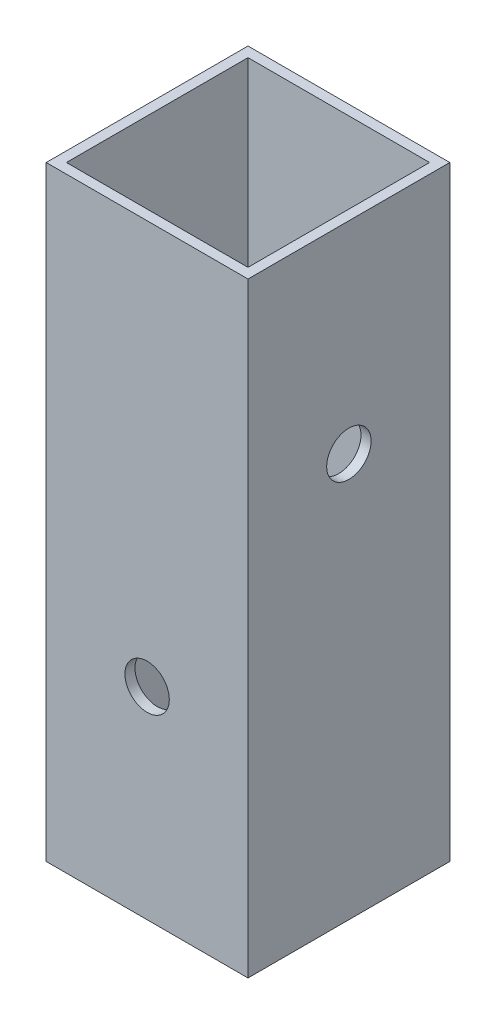
ISO-10303-21;
HEADER;
FILE_DESCRIPTION(('STEP AP214'),'2;1');
FILE_NAME('part.step','',(''),(''),'','','');
FILE_SCHEMA(('AUTOMOTIVE_DESIGN { 1 0 10303 214 1 1 1 1 }'));
ENDSEC;
DATA;
#1=APPLICATION_CONTEXT('core data for automotive mechanical design processes');
#2=APPLICATION_PROTOCOL_DEFINITION('international standard','automotive_design',2000,#1);
#3=PRODUCT_CONTEXT('',#1,'mechanical');
#4=PRODUCT('Part','Part','',(#3));
#5=PRODUCT_RELATED_PRODUCT_CATEGORY('part','',(#4));
#6=PRODUCT_DEFINITION_FORMATION('','',#4);
#7=PRODUCT_DEFINITION_CONTEXT('part definition',#1,'design');
#8=PRODUCT_DEFINITION('design','',#6,#7);
#9=PRODUCT_DEFINITION_SHAPE('','',#8);
#10=(LENGTH_UNIT() NAMED_UNIT(*) SI_UNIT(.MILLI.,.METRE.));
#11=(NAMED_UNIT(*) PLANE_ANGLE_UNIT() SI_UNIT($,.RADIAN.));
#12=(NAMED_UNIT(*) SI_UNIT($,.STERADIAN.) SOLID_ANGLE_UNIT());
#13=UNCERTAINTY_MEASURE_WITH_UNIT(LENGTH_MEASURE(1.E-05),#10,'distance_accuracy_value','');
#14=(GEOMETRIC_REPRESENTATION_CONTEXT(3) GLOBAL_UNCERTAINTY_ASSIGNED_CONTEXT((#13)) GLOBAL_UNIT_ASSIGNED_CONTEXT((#10,
#11,#12)) REPRESENTATION_CONTEXT('',''));
#15=CARTESIAN_POINT('',(0.,0.,0.));
#16=DIRECTION('',(0.,0.,1.));
#17=DIRECTION('',(1.,0.,0.));
#18=AXIS2_PLACEMENT_3D('',#15,#16,#17);
#19=CARTESIAN_POINT('',(0.,-280.,10.));
#20=DIRECTION('',(0.,0.,1.));
#21=DIRECTION('',(1.,0.,0.));
#22=AXIS2_PLACEMENT_3D('',#19,#20,#21);
#23=PLANE('',#22);
#24=DIRECTION('',(1.,0.,0.));
#25=VECTOR('',#24,1.);
#26=CARTESIAN_POINT('',(1.85733876412832E-12,-220.,10.));
#27=LINE('',#26,#25);
#28=CARTESIAN_POINT('',(-10.0000000000001,-220.,10.));
#29=VERTEX_POINT('',#28);
#30=CARTESIAN_POINT('',(9.99999999999997,-220.,10.));
#31=VERTEX_POINT('',#30);
#32=EDGE_CURVE('E108',#29,#31,#27,.T.);
#33=ORIENTED_EDGE('',*,*,#32,.F.);
#34=DIRECTION('',(0.,1.,0.));
#35=VECTOR('',#34,1.);
#36=CARTESIAN_POINT('',(-10.0000000000001,-280.,9.99999999999993));
#37=LINE('',#36,#35);
#38=CARTESIAN_POINT('',(-10.0000000000001,-280.,9.99999999999993));
#39=VERTEX_POINT('',#38);
#40=EDGE_CURVE('E49',#39,#29,#37,.T.);
#41=ORIENTED_EDGE('',*,*,#40,.F.);
#42=DIRECTION('',(1.,0.,0.));
#43=VECTOR('',#42,1.);
#44=CARTESIAN_POINT('',(0.,-280.,10.));
#45=LINE('',#44,#43);
#46=CARTESIAN_POINT('',(9.99999999999997,-280.,10.));
#47=VERTEX_POINT('',#46);
#48=EDGE_CURVE('E64',#39,#47,#45,.T.);
#49=ORIENTED_EDGE('',*,*,#48,.T.);
#50=DIRECTION('',(0.,1.,0.));
#51=VECTOR('',#50,1.);
#52=CARTESIAN_POINT('',(9.99999999999997,-280.,10.));
#53=LINE('',#52,#51);
#54=EDGE_CURVE('E11',#47,#31,#53,.T.);
#55=ORIENTED_EDGE('',*,*,#54,.T.);
#56=EDGE_LOOP('',(#33,#41,#49,#55));
#57=FACE_BOUND('',#56,.T.);
#58=CARTESIAN_POINT('',(2.2763165247895E-12,-260.,10.));
#59=DIRECTION('',(0.,0.,1.));
#60=DIRECTION('',(1.,0.,0.));
#61=AXIS2_PLACEMENT_3D('',#58,#59,#60);
#62=CIRCLE('',#61,2.19999999999999);
#63=CARTESIAN_POINT('',(2.20000000000227,-260.,10.));
#64=VERTEX_POINT('',#63);
#65=EDGE_CURVE('E133',#64,#64,#62,.T.);
#66=ORIENTED_EDGE('',*,*,#65,.F.);
#67=EDGE_LOOP('',(#66));
#68=FACE_BOUND('',#67,.T.);
#69=ADVANCED_FACE('F39',(#57,#68),#23,.T.);
#70=CARTESIAN_POINT('',(-10.,-280.,0.));
#71=DIRECTION('',(-1.,0.,0.));
#72=DIRECTION('',(0.,0.,1.));
#73=AXIS2_PLACEMENT_3D('',#70,#71,#72);
#74=PLANE('',#73);
#75=DIRECTION('',(0.,0.,1.));
#76=VECTOR('',#75,1.);
#77=CARTESIAN_POINT('',(-10.0000000000001,-220.,-49.));
#78=LINE('',#77,#76);
#79=CARTESIAN_POINT('',(-10.0000000000001,-220.,-10.));
#80=VERTEX_POINT('',#79);
#81=EDGE_CURVE('E115',#80,#29,#78,.T.);
#82=ORIENTED_EDGE('',*,*,#81,.F.);
#83=DIRECTION('',(0.,1.,0.));
#84=VECTOR('',#83,1.);
#85=CARTESIAN_POINT('',(-9.9999999999999,-280.,-10.0000000000001));
#86=LINE('',#85,#84);
#87=CARTESIAN_POINT('',(-9.9999999999999,-280.,-10.0000000000001));
#88=VERTEX_POINT('',#87);
#89=EDGE_CURVE('E196',#88,#80,#86,.T.);
#90=ORIENTED_EDGE('',*,*,#89,.F.);
#91=DIRECTION('',(0.,0.,1.));
#92=VECTOR('',#91,1.);
#93=CARTESIAN_POINT('',(-10.,-280.,0.));
#94=LINE('',#93,#92);
#95=EDGE_CURVE('E189',#88,#39,#94,.T.);
#96=ORIENTED_EDGE('',*,*,#95,.T.);
#97=ORIENTED_EDGE('',*,*,#40,.T.);
#98=EDGE_LOOP('',(#82,#90,#96,#97));
#99=FACE_BOUND('',#98,.T.);
#100=CARTESIAN_POINT('',(-10.,-240.,0.));
#101=DIRECTION('',(1.,0.,0.));
#102=DIRECTION('',(0.,0.,-1.));
#103=AXIS2_PLACEMENT_3D('',#100,#101,#102);
#104=CIRCLE('',#103,2.2);
#105=CARTESIAN_POINT('',(-10.,-240.,-2.20000000000001));
#106=VERTEX_POINT('',#105);
#107=EDGE_CURVE('E336',#106,#106,#104,.T.);
#108=ORIENTED_EDGE('',*,*,#107,.T.);
#109=EDGE_LOOP('',(#108));
#110=FACE_BOUND('',#109,.T.);
#111=ADVANCED_FACE('F129',(#99,#110),#74,.T.);
#112=CARTESIAN_POINT('',(0.,-280.,-10.));
#113=DIRECTION('',(0.,0.,-1.));
#114=DIRECTION('',(-1.,0.,0.));
#115=AXIS2_PLACEMENT_3D('',#112,#113,#114);
#116=PLANE('',#115);
#117=DIRECTION('',(-1.,0.,0.));
#118=VECTOR('',#117,1.);
#119=CARTESIAN_POINT('',(0.,-220.,-10.));
#120=LINE('',#119,#118);
#121=CARTESIAN_POINT('',(9.99999999999997,-220.,-10.));
#122=VERTEX_POINT('',#121);
#123=EDGE_CURVE('E205',#122,#80,#120,.T.);
#124=ORIENTED_EDGE('',*,*,#123,.F.);
#125=DIRECTION('',(0.,1.,0.));
#126=VECTOR('',#125,1.);
#127=CARTESIAN_POINT('',(10.,-280.,-10.));
#128=LINE('',#127,#126);
#129=CARTESIAN_POINT('',(10.,-280.,-10.));
#130=VERTEX_POINT('',#129);
#131=EDGE_CURVE('E124',#130,#122,#128,.T.);
#132=ORIENTED_EDGE('',*,*,#131,.F.);
#133=DIRECTION('',(-1.,0.,0.));
#134=VECTOR('',#133,1.);
#135=CARTESIAN_POINT('',(0.,-280.,-10.));
#136=LINE('',#135,#134);
#137=EDGE_CURVE('E186',#130,#88,#136,.T.);
#138=ORIENTED_EDGE('',*,*,#137,.T.);
#139=ORIENTED_EDGE('',*,*,#89,.T.);
#140=EDGE_LOOP('',(#124,#132,#138,#139));
#141=FACE_BOUND('',#140,.T.);
#142=CARTESIAN_POINT('',(2.2763165247895E-12,-260.,-10.));
#143=DIRECTION('',(0.,0.,-1.));
#144=DIRECTION('',(-1.,0.,0.));
#145=AXIS2_PLACEMENT_3D('',#142,#143,#144);
#146=CIRCLE('',#145,2.19999999999999);
#147=CARTESIAN_POINT('',(-2.19999999999772,-260.,-10.));
#148=VERTEX_POINT('',#147);
#149=EDGE_CURVE('E150',#148,#148,#146,.T.);
#150=ORIENTED_EDGE('',*,*,#149,.F.);
#151=EDGE_LOOP('',(#150));
#152=FACE_BOUND('',#151,.T.);
#153=ADVANCED_FACE('F203',(#141,#152),#116,.T.);
#154=CARTESIAN_POINT('',(10.,-280.,0.));
#155=DIRECTION('',(1.,0.,0.));
#156=DIRECTION('',(0.,0.,-1.));
#157=AXIS2_PLACEMENT_3D('',#154,#155,#156);
#158=PLANE('',#157);
#159=DIRECTION('',(0.,0.,1.));
#160=VECTOR('',#159,1.);
#161=CARTESIAN_POINT('',(9.99999999999997,-220.,-49.));
#162=LINE('',#161,#160);
#163=EDGE_CURVE('E112',#122,#31,#162,.T.);
#164=ORIENTED_EDGE('',*,*,#163,.T.);
#165=ORIENTED_EDGE('',*,*,#54,.F.);
#166=DIRECTION('',(0.,0.,-1.));
#167=VECTOR('',#166,1.);
#168=CARTESIAN_POINT('',(10.,-280.,0.));
#169=LINE('',#168,#167);
#170=EDGE_CURVE('E173',#47,#130,#169,.T.);
#171=ORIENTED_EDGE('',*,*,#170,.T.);
#172=ORIENTED_EDGE('',*,*,#131,.T.);
#173=EDGE_LOOP('',(#164,#165,#171,#172));
#174=FACE_BOUND('',#173,.T.);
#175=CARTESIAN_POINT('',(10.,-240.,0.));
#176=DIRECTION('',(1.,0.,0.));
#177=DIRECTION('',(0.,0.,-1.));
#178=AXIS2_PLACEMENT_3D('',#175,#176,#177);
#179=CIRCLE('',#178,2.2);
#180=CARTESIAN_POINT('',(10.,-240.,-2.20000000000001));
#181=VERTEX_POINT('',#180);
#182=EDGE_CURVE('E359',#181,#181,#179,.T.);
#183=ORIENTED_EDGE('',*,*,#182,.F.);
#184=EDGE_LOOP('',(#183));
#185=FACE_BOUND('',#184,.T.);
#186=ADVANCED_FACE('F41',(#174,#185),#158,.T.);
#187=CARTESIAN_POINT('',(0.,-280.,0.));
#188=DIRECTION('',(0.,1.,0.));
#189=DIRECTION('',(0.,0.,1.));
#190=AXIS2_PLACEMENT_3D('',#187,#188,#189);
#191=PLANE('',#190);
#192=DIRECTION('',(0.,0.,1.));
#193=VECTOR('',#192,1.);
#194=CARTESIAN_POINT('',(-9.,-280.,0.));
#195=LINE('',#194,#193);
#196=CARTESIAN_POINT('',(-8.99999999999991,-280.,-9.00000000000009));
#197=VERTEX_POINT('',#196);
#198=CARTESIAN_POINT('',(-9.00000000000006,-280.,8.99999999999994));
#199=VERTEX_POINT('',#198);
#200=EDGE_CURVE('E160',#197,#199,#195,.T.);
#201=ORIENTED_EDGE('',*,*,#200,.T.);
#202=DIRECTION('',(1.,0.,0.));
#203=VECTOR('',#202,1.);
#204=CARTESIAN_POINT('',(0.,-280.,9.));
#205=LINE('',#204,#203);
#206=CARTESIAN_POINT('',(8.99999999999997,-280.,9.00000000000003));
#207=VERTEX_POINT('',#206);
#208=EDGE_CURVE('E164',#199,#207,#205,.T.);
#209=ORIENTED_EDGE('',*,*,#208,.T.);
#210=DIRECTION('',(0.,0.,-1.));
#211=VECTOR('',#210,1.);
#212=CARTESIAN_POINT('',(9.,-280.,0.));
#213=LINE('',#212,#211);
#214=CARTESIAN_POINT('',(9.,-280.,-9.));
#215=VERTEX_POINT('',#214);
#216=EDGE_CURVE('E154',#207,#215,#213,.T.);
#217=ORIENTED_EDGE('',*,*,#216,.T.);
#218=DIRECTION('',(-1.,0.,0.));
#219=VECTOR('',#218,1.);
#220=CARTESIAN_POINT('',(0.,-280.,-9.));
#221=LINE('',#220,#219);
#222=EDGE_CURVE('E57',#215,#197,#221,.T.);
#223=ORIENTED_EDGE('',*,*,#222,.T.);
#224=EDGE_LOOP('',(#201,#209,#217,#223));
#225=FACE_BOUND('',#224,.T.);
#226=ORIENTED_EDGE('',*,*,#170,.F.);
#227=ORIENTED_EDGE('',*,*,#48,.F.);
#228=ORIENTED_EDGE('',*,*,#95,.F.);
#229=ORIENTED_EDGE('',*,*,#137,.F.);
#230=EDGE_LOOP('',(#226,#227,#228,#229));
#231=FACE_BOUND('',#230,.T.);
#232=ADVANCED_FACE('F211',(#225,#231),#191,.F.);
#233=CARTESIAN_POINT('',(0.,-280.,9.));
#234=DIRECTION('',(0.,0.,1.));
#235=DIRECTION('',(1.,0.,0.));
#236=AXIS2_PLACEMENT_3D('',#233,#234,#235);
#237=PLANE('',#236);
#238=DIRECTION('',(0.,1.,0.));
#239=VECTOR('',#238,1.);
#240=CARTESIAN_POINT('',(-9.00000000000006,-280.,8.99999999999994));
#241=LINE('',#240,#239);
#242=CARTESIAN_POINT('',(-9.00000000000006,-220.,8.99999999999997));
#243=VERTEX_POINT('',#242);
#244=EDGE_CURVE('E174',#199,#243,#241,.T.);
#245=ORIENTED_EDGE('',*,*,#244,.T.);
#246=DIRECTION('',(1.,0.,0.));
#247=VECTOR('',#246,1.);
#248=CARTESIAN_POINT('',(0.,-220.,9.));
#249=LINE('',#248,#247);
#250=CARTESIAN_POINT('',(9.,-220.,9.00000000000003));
#251=VERTEX_POINT('',#250);
#252=EDGE_CURVE('E349',#243,#251,#249,.T.);
#253=ORIENTED_EDGE('',*,*,#252,.T.);
#254=DIRECTION('',(0.,1.,0.));
#255=VECTOR('',#254,1.);
#256=CARTESIAN_POINT('',(8.99999999999997,-280.,9.00000000000003));
#257=LINE('',#256,#255);
#258=EDGE_CURVE('E169',#207,#251,#257,.T.);
#259=ORIENTED_EDGE('',*,*,#258,.F.);
#260=ORIENTED_EDGE('',*,*,#208,.F.);
#261=EDGE_LOOP('',(#245,#253,#259,#260));
#262=FACE_BOUND('',#261,.T.);
#263=CARTESIAN_POINT('',(2.2763165247895E-12,-260.,9.00000000000001));
#264=DIRECTION('',(0.,0.,1.));
#265=DIRECTION('',(1.,0.,0.));
#266=AXIS2_PLACEMENT_3D('',#263,#264,#265);
#267=CIRCLE('',#266,2.19999999999999);
#268=CARTESIAN_POINT('',(2.20000000000227,-260.,9.00000000000001));
#269=VERTEX_POINT('',#268);
#270=EDGE_CURVE('E142',#269,#269,#267,.T.);
#271=ORIENTED_EDGE('',*,*,#270,.T.);
#272=EDGE_LOOP('',(#271));
#273=FACE_BOUND('',#272,.T.);
#274=ADVANCED_FACE('F213',(#262,#273),#237,.F.);
#275=CARTESIAN_POINT('',(-9.,-280.,0.));
#276=DIRECTION('',(-1.,0.,0.));
#277=DIRECTION('',(0.,0.,1.));
#278=AXIS2_PLACEMENT_3D('',#275,#276,#277);
#279=PLANE('',#278);
#280=CARTESIAN_POINT('',(-9.,-240.,0.));
#281=DIRECTION('',(-1.,0.,0.));
#282=DIRECTION('',(0.,0.,1.));
#283=AXIS2_PLACEMENT_3D('',#280,#281,#282);
#284=CIRCLE('',#283,2.2);
#285=CARTESIAN_POINT('',(-9.00000000000001,-240.,2.2));
#286=VERTEX_POINT('',#285);
#287=EDGE_CURVE('E137',#286,#286,#284,.T.);
#288=ORIENTED_EDGE('',*,*,#287,.T.);
#289=EDGE_LOOP('',(#288));
#290=FACE_BOUND('',#289,.T.);
#291=DIRECTION('',(0.,1.,0.));
#292=VECTOR('',#291,1.);
#293=CARTESIAN_POINT('',(-8.99999999999991,-280.,-9.00000000000009));
#294=LINE('',#293,#292);
#295=CARTESIAN_POINT('',(-8.99999999999994,-220.,-9.00000000000009));
#296=VERTEX_POINT('',#295);
#297=EDGE_CURVE('E178',#197,#296,#294,.T.);
#298=ORIENTED_EDGE('',*,*,#297,.T.);
#299=DIRECTION('',(0.,0.,1.));
#300=VECTOR('',#299,1.);
#301=CARTESIAN_POINT('',(-9.,-220.,0.));
#302=LINE('',#301,#300);
#303=EDGE_CURVE('E342',#296,#243,#302,.T.);
#304=ORIENTED_EDGE('',*,*,#303,.T.);
#305=ORIENTED_EDGE('',*,*,#244,.F.);
#306=ORIENTED_EDGE('',*,*,#200,.F.);
#307=EDGE_LOOP('',(#298,#304,#305,#306));
#308=FACE_BOUND('',#307,.T.);
#309=ADVANCED_FACE('F220',(#290,#308),#279,.F.);
#310=CARTESIAN_POINT('',(0.,-280.,-9.));
#311=DIRECTION('',(0.,0.,-1.));
#312=DIRECTION('',(-1.,0.,0.));
#313=AXIS2_PLACEMENT_3D('',#310,#311,#312);
#314=PLANE('',#313);
#315=DIRECTION('',(-1.,0.,0.));
#316=VECTOR('',#315,1.);
#317=CARTESIAN_POINT('',(0.,-220.,-9.));
#318=LINE('',#317,#316);
#319=CARTESIAN_POINT('',(9.,-220.,-9.));
#320=VERTEX_POINT('',#319);
#321=EDGE_CURVE('E343',#320,#296,#318,.T.);
#322=ORIENTED_EDGE('',*,*,#321,.T.);
#323=ORIENTED_EDGE('',*,*,#297,.F.);
#324=ORIENTED_EDGE('',*,*,#222,.F.);
#325=DIRECTION('',(0.,1.,0.));
#326=VECTOR('',#325,1.);
#327=CARTESIAN_POINT('',(9.,-280.,-9.));
#328=LINE('',#327,#326);
#329=EDGE_CURVE('E168',#215,#320,#328,.T.);
#330=ORIENTED_EDGE('',*,*,#329,.T.);
#331=EDGE_LOOP('',(#322,#323,#324,#330));
#332=FACE_BOUND('',#331,.T.);
#333=CARTESIAN_POINT('',(2.2763165247895E-12,-260.,-9.00000000000001));
#334=DIRECTION('',(0.,0.,-1.));
#335=DIRECTION('',(-1.,0.,0.));
#336=AXIS2_PLACEMENT_3D('',#333,#334,#335);
#337=CIRCLE('',#336,2.19999999999999);
#338=CARTESIAN_POINT('',(-2.19999999999772,-260.,-9.00000000000003));
#339=VERTEX_POINT('',#338);
#340=EDGE_CURVE('E136',#339,#339,#337,.T.);
#341=ORIENTED_EDGE('',*,*,#340,.T.);
#342=EDGE_LOOP('',(#341));
#343=FACE_BOUND('',#342,.T.);
#344=ADVANCED_FACE('F253',(#332,#343),#314,.F.);
#345=CARTESIAN_POINT('',(9.,-280.,0.));
#346=DIRECTION('',(1.,0.,0.));
#347=DIRECTION('',(0.,0.,-1.));
#348=AXIS2_PLACEMENT_3D('',#345,#346,#347);
#349=PLANE('',#348);
#350=CARTESIAN_POINT('',(9.,-240.,0.));
#351=DIRECTION('',(1.,0.,0.));
#352=DIRECTION('',(0.,0.,-1.));
#353=AXIS2_PLACEMENT_3D('',#350,#351,#352);
#354=CIRCLE('',#353,2.2);
#355=CARTESIAN_POINT('',(9.,-240.,-2.20000000000001));
#356=VERTEX_POINT('',#355);
#357=EDGE_CURVE('E43',#356,#356,#354,.T.);
#358=ORIENTED_EDGE('',*,*,#357,.T.);
#359=EDGE_LOOP('',(#358));
#360=FACE_BOUND('',#359,.T.);
#361=ORIENTED_EDGE('',*,*,#258,.T.);
#362=DIRECTION('',(0.,0.,-1.));
#363=VECTOR('',#362,1.);
#364=CARTESIAN_POINT('',(9.,-220.,0.));
#365=LINE('',#364,#363);
#366=EDGE_CURVE('E346',#251,#320,#365,.T.);
#367=ORIENTED_EDGE('',*,*,#366,.T.);
#368=ORIENTED_EDGE('',*,*,#329,.F.);
#369=ORIENTED_EDGE('',*,*,#216,.F.);
#370=EDGE_LOOP('',(#361,#367,#368,#369));
#371=FACE_BOUND('',#370,.T.);
#372=ADVANCED_FACE('F224',(#360,#371),#349,.F.);
#373=CARTESIAN_POINT('',(2.2763165247895E-12,-260.,-270.));
#374=DIRECTION('',(0.,0.,1.));
#375=DIRECTION('',(1.,0.,0.));
#376=AXIS2_PLACEMENT_3D('',#373,#374,#375);
#377=CYLINDRICAL_SURFACE('',#376,2.19999999999999);
#378=ORIENTED_EDGE('',*,*,#149,.T.);
#379=EDGE_LOOP('',(#378));
#380=FACE_BOUND('',#379,.T.);
#381=ORIENTED_EDGE('',*,*,#340,.F.);
#382=EDGE_LOOP('',(#381));
#383=FACE_BOUND('',#382,.T.);
#384=ADVANCED_FACE('F265',(#380,#383),#377,.F.);
#385=ORIENTED_EDGE('',*,*,#65,.T.);
#386=EDGE_LOOP('',(#385));
#387=FACE_BOUND('',#386,.T.);
#388=ORIENTED_EDGE('',*,*,#270,.F.);
#389=EDGE_LOOP('',(#388));
#390=FACE_BOUND('',#389,.T.);
#391=ADVANCED_FACE('F324',(#387,#390),#377,.F.);
#392=CARTESIAN_POINT('',(-10.,-240.,0.));
#393=DIRECTION('',(1.,0.,0.));
#394=DIRECTION('',(0.,0.,-1.));
#395=AXIS2_PLACEMENT_3D('',#392,#393,#394);
#396=CYLINDRICAL_SURFACE('',#395,2.2);
#397=ORIENTED_EDGE('',*,*,#182,.T.);
#398=EDGE_LOOP('',(#397));
#399=FACE_BOUND('',#398,.T.);
#400=ORIENTED_EDGE('',*,*,#357,.F.);
#401=EDGE_LOOP('',(#400));
#402=FACE_BOUND('',#401,.T.);
#403=ADVANCED_FACE('F327',(#399,#402),#396,.F.);
#404=ORIENTED_EDGE('',*,*,#107,.F.);
#405=EDGE_LOOP('',(#404));
#406=FACE_BOUND('',#405,.T.);
#407=ORIENTED_EDGE('',*,*,#287,.F.);
#408=EDGE_LOOP('',(#407));
#409=FACE_BOUND('',#408,.T.);
#410=ADVANCED_FACE('F299',(#406,#409),#396,.F.);
#411=CARTESIAN_POINT('',(1.85733876412832E-12,-220.,-49.));
#412=DIRECTION('',(0.,-1.,0.));
#413=DIRECTION('',(0.,0.,-1.));
#414=AXIS2_PLACEMENT_3D('',#411,#412,#413);
#415=PLANE('',#414);
#416=ORIENTED_EDGE('',*,*,#32,.T.);
#417=ORIENTED_EDGE('',*,*,#163,.F.);
#418=ORIENTED_EDGE('',*,*,#123,.T.);
#419=ORIENTED_EDGE('',*,*,#81,.T.);
#420=EDGE_LOOP('',(#416,#417,#418,#419));
#421=FACE_BOUND('',#420,.T.);
#422=ORIENTED_EDGE('',*,*,#303,.F.);
#423=ORIENTED_EDGE('',*,*,#321,.F.);
#424=ORIENTED_EDGE('',*,*,#366,.F.);
#425=ORIENTED_EDGE('',*,*,#252,.F.);
#426=EDGE_LOOP('',(#422,#423,#424,#425));
#427=FACE_BOUND('',#426,.T.);
#428=ADVANCED_FACE('F110',(#421,#427),#415,.F.);
#429=CLOSED_SHELL('',(#69,#111,#153,#186,#232,#274,#309,#344,#372,#384,#391,#403,#410,#428));
#430=MANIFOLD_SOLID_BREP('B2',#429);
#431=ADVANCED_BREP_SHAPE_REPRESENTATION('',(#18,#430),#14);
#432=SHAPE_DEFINITION_REPRESENTATION(#9,#431);
ENDSEC;
END-ISO-10303-21;
